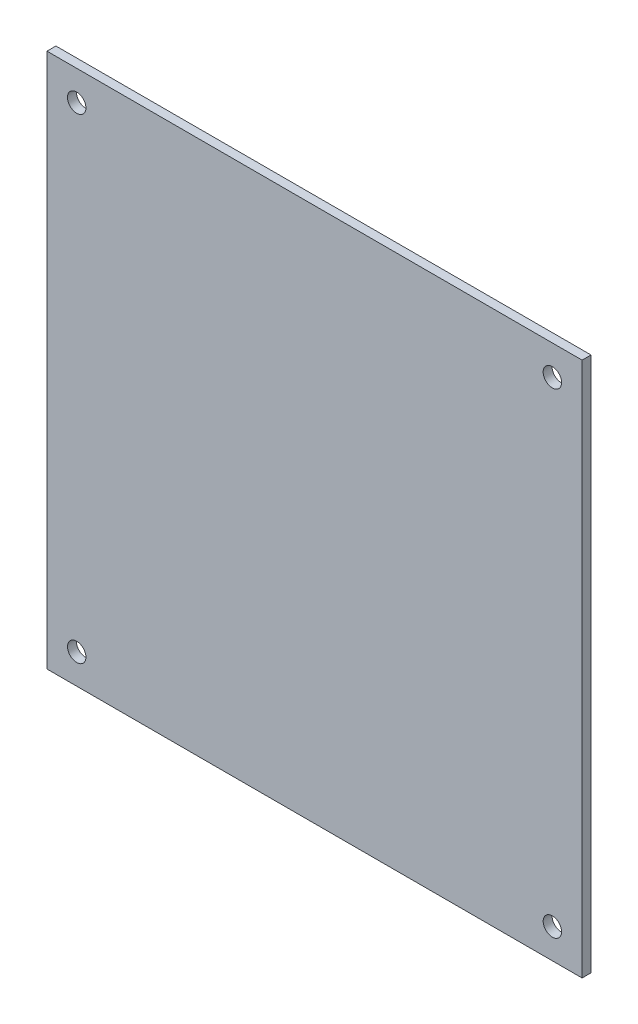
ISO-10303-21;
HEADER;
FILE_DESCRIPTION(('STEP AP214'),'2;1');
FILE_NAME('part.step','',(''),(''),'','','');
FILE_SCHEMA(('AUTOMOTIVE_DESIGN { 1 0 10303 214 1 1 1 1 }'));
ENDSEC;
DATA;
#1=APPLICATION_CONTEXT('core data for automotive mechanical design processes');
#2=APPLICATION_PROTOCOL_DEFINITION('international standard','automotive_design',2000,#1);
#3=PRODUCT_CONTEXT('',#1,'mechanical');
#4=PRODUCT('Part','Part','',(#3));
#5=PRODUCT_RELATED_PRODUCT_CATEGORY('part','',(#4));
#6=PRODUCT_DEFINITION_FORMATION('','',#4);
#7=PRODUCT_DEFINITION_CONTEXT('part definition',#1,'design');
#8=PRODUCT_DEFINITION('design','',#6,#7);
#9=PRODUCT_DEFINITION_SHAPE('','',#8);
#10=(LENGTH_UNIT() NAMED_UNIT(*) SI_UNIT(.MILLI.,.METRE.));
#11=(NAMED_UNIT(*) PLANE_ANGLE_UNIT() SI_UNIT($,.RADIAN.));
#12=(NAMED_UNIT(*) SI_UNIT($,.STERADIAN.) SOLID_ANGLE_UNIT());
#13=UNCERTAINTY_MEASURE_WITH_UNIT(LENGTH_MEASURE(1.E-05),#10,'distance_accuracy_value','');
#14=(GEOMETRIC_REPRESENTATION_CONTEXT(3) GLOBAL_UNCERTAINTY_ASSIGNED_CONTEXT((#13)) GLOBAL_UNIT_ASSIGNED_CONTEXT((#10,
#11,#12)) REPRESENTATION_CONTEXT('',''));
#15=CARTESIAN_POINT('',(0.,0.,0.));
#16=DIRECTION('',(0.,0.,1.));
#17=DIRECTION('',(1.,0.,0.));
#18=AXIS2_PLACEMENT_3D('',#15,#16,#17);
#19=CARTESIAN_POINT('',(-45.,-45.,1.5));
#20=DIRECTION('',(1.,0.,0.));
#21=DIRECTION('',(0.,0.,-1.));
#22=AXIS2_PLACEMENT_3D('',#19,#20,#21);
#23=PLANE('',#22);
#24=DIRECTION('',(0.,-1.,0.));
#25=VECTOR('',#24,1.);
#26=CARTESIAN_POINT('',(-45.,-45.,0.));
#27=LINE('',#26,#25);
#28=CARTESIAN_POINT('',(-45.,45.,0.));
#29=VERTEX_POINT('',#28);
#30=CARTESIAN_POINT('',(-45.,-45.,0.));
#31=VERTEX_POINT('',#30);
#32=EDGE_CURVE('E98',#29,#31,#27,.T.);
#33=ORIENTED_EDGE('',*,*,#32,.T.);
#34=DIRECTION('',(0.,0.,-1.));
#35=VECTOR('',#34,1.);
#36=CARTESIAN_POINT('',(-45.,-45.,1.5));
#37=LINE('',#36,#35);
#38=CARTESIAN_POINT('',(-45.,-45.,1.5));
#39=VERTEX_POINT('',#38);
#40=EDGE_CURVE('E11',#39,#31,#37,.T.);
#41=ORIENTED_EDGE('',*,*,#40,.F.);
#42=DIRECTION('',(0.,-1.,0.));
#43=VECTOR('',#42,1.);
#44=CARTESIAN_POINT('',(-45.,-45.,1.5));
#45=LINE('',#44,#43);
#46=CARTESIAN_POINT('',(-45.,45.,1.5));
#47=VERTEX_POINT('',#46);
#48=EDGE_CURVE('E86',#47,#39,#45,.T.);
#49=ORIENTED_EDGE('',*,*,#48,.F.);
#50=DIRECTION('',(0.,0.,-1.));
#51=VECTOR('',#50,1.);
#52=CARTESIAN_POINT('',(-45.,45.,1.5));
#53=LINE('',#52,#51);
#54=EDGE_CURVE('E94',#47,#29,#53,.T.);
#55=ORIENTED_EDGE('',*,*,#54,.T.);
#56=EDGE_LOOP('',(#33,#41,#49,#55));
#57=FACE_BOUND('',#56,.T.);
#58=ADVANCED_FACE('F35',(#57),#23,.F.);
#59=CARTESIAN_POINT('',(45.,-45.,1.5));
#60=DIRECTION('',(0.,1.,0.));
#61=DIRECTION('',(-1.,0.,0.));
#62=AXIS2_PLACEMENT_3D('',#59,#60,#61);
#63=PLANE('',#62);
#64=DIRECTION('',(1.,0.,0.));
#65=VECTOR('',#64,1.);
#66=CARTESIAN_POINT('',(45.,-45.,0.));
#67=LINE('',#66,#65);
#68=CARTESIAN_POINT('',(45.,-45.,0.));
#69=VERTEX_POINT('',#68);
#70=EDGE_CURVE('E90',#31,#69,#67,.T.);
#71=ORIENTED_EDGE('',*,*,#70,.T.);
#72=DIRECTION('',(0.,0.,-1.));
#73=VECTOR('',#72,1.);
#74=CARTESIAN_POINT('',(45.,-45.,1.5));
#75=LINE('',#74,#73);
#76=CARTESIAN_POINT('',(45.,-45.,1.5));
#77=VERTEX_POINT('',#76);
#78=EDGE_CURVE('E43',#77,#69,#75,.T.);
#79=ORIENTED_EDGE('',*,*,#78,.F.);
#80=DIRECTION('',(1.,0.,0.));
#81=VECTOR('',#80,1.);
#82=CARTESIAN_POINT('',(45.,-45.,1.5));
#83=LINE('',#82,#81);
#84=EDGE_CURVE('E81',#39,#77,#83,.T.);
#85=ORIENTED_EDGE('',*,*,#84,.F.);
#86=ORIENTED_EDGE('',*,*,#40,.T.);
#87=EDGE_LOOP('',(#71,#79,#85,#86));
#88=FACE_BOUND('',#87,.T.);
#89=ADVANCED_FACE('F89',(#88),#63,.F.);
#90=CARTESIAN_POINT('',(45.,-45.,1.5));
#91=DIRECTION('',(-1.,0.,0.));
#92=DIRECTION('',(0.,0.,1.));
#93=AXIS2_PLACEMENT_3D('',#90,#91,#92);
#94=PLANE('',#93);
#95=DIRECTION('',(0.,1.,0.));
#96=VECTOR('',#95,1.);
#97=CARTESIAN_POINT('',(45.,-45.,0.));
#98=LINE('',#97,#96);
#99=CARTESIAN_POINT('',(45.,45.,0.));
#100=VERTEX_POINT('',#99);
#101=EDGE_CURVE('E68',#69,#100,#98,.T.);
#102=ORIENTED_EDGE('',*,*,#101,.T.);
#103=DIRECTION('',(0.,0.,-1.));
#104=VECTOR('',#103,1.);
#105=CARTESIAN_POINT('',(45.,45.,1.5));
#106=LINE('',#105,#104);
#107=CARTESIAN_POINT('',(45.,45.,1.5));
#108=VERTEX_POINT('',#107);
#109=EDGE_CURVE('E91',#108,#100,#106,.T.);
#110=ORIENTED_EDGE('',*,*,#109,.F.);
#111=DIRECTION('',(0.,1.,0.));
#112=VECTOR('',#111,1.);
#113=CARTESIAN_POINT('',(45.,-45.,1.5));
#114=LINE('',#113,#112);
#115=EDGE_CURVE('E84',#77,#108,#114,.T.);
#116=ORIENTED_EDGE('',*,*,#115,.F.);
#117=ORIENTED_EDGE('',*,*,#78,.T.);
#118=EDGE_LOOP('',(#102,#110,#116,#117));
#119=FACE_BOUND('',#118,.T.);
#120=ADVANCED_FACE('F92',(#119),#94,.F.);
#121=CARTESIAN_POINT('',(45.,45.,1.5));
#122=DIRECTION('',(0.,-1.,0.));
#123=DIRECTION('',(1.,0.,0.));
#124=AXIS2_PLACEMENT_3D('',#121,#122,#123);
#125=PLANE('',#124);
#126=DIRECTION('',(-1.,0.,0.));
#127=VECTOR('',#126,1.);
#128=CARTESIAN_POINT('',(45.,45.,0.));
#129=LINE('',#128,#127);
#130=EDGE_CURVE('E74',#100,#29,#129,.T.);
#131=ORIENTED_EDGE('',*,*,#130,.T.);
#132=ORIENTED_EDGE('',*,*,#54,.F.);
#133=DIRECTION('',(-1.,0.,0.));
#134=VECTOR('',#133,1.);
#135=CARTESIAN_POINT('',(45.,45.,1.5));
#136=LINE('',#135,#134);
#137=EDGE_CURVE('E51',#108,#47,#136,.T.);
#138=ORIENTED_EDGE('',*,*,#137,.F.);
#139=ORIENTED_EDGE('',*,*,#109,.T.);
#140=EDGE_LOOP('',(#131,#132,#138,#139));
#141=FACE_BOUND('',#140,.T.);
#142=ADVANCED_FACE('F106',(#141),#125,.F.);
#143=CARTESIAN_POINT('',(0.,0.,1.5));
#144=DIRECTION('',(0.,0.,1.));
#145=DIRECTION('',(1.,0.,0.));
#146=AXIS2_PLACEMENT_3D('',#143,#144,#145);
#147=PLANE('',#146);
#148=CARTESIAN_POINT('',(-40.,40.,1.5));
#149=DIRECTION('',(0.,0.,1.));
#150=DIRECTION('',(1.,0.,0.));
#151=AXIS2_PLACEMENT_3D('',#148,#149,#150);
#152=CIRCLE('',#151,1.54999999999999);
#153=CARTESIAN_POINT('',(-38.45,40.,1.5));
#154=VERTEX_POINT('',#153);
#155=EDGE_CURVE('E132',#154,#154,#152,.T.);
#156=ORIENTED_EDGE('',*,*,#155,.F.);
#157=EDGE_LOOP('',(#156));
#158=FACE_BOUND('',#157,.T.);
#159=CARTESIAN_POINT('',(40.,40.,1.5));
#160=DIRECTION('',(0.,0.,1.));
#161=DIRECTION('',(1.,0.,0.));
#162=AXIS2_PLACEMENT_3D('',#159,#160,#161);
#163=CIRCLE('',#162,1.54999999999999);
#164=CARTESIAN_POINT('',(41.55,40.,1.5));
#165=VERTEX_POINT('',#164);
#166=EDGE_CURVE('E126',#165,#165,#163,.T.);
#167=ORIENTED_EDGE('',*,*,#166,.F.);
#168=EDGE_LOOP('',(#167));
#169=FACE_BOUND('',#168,.T.);
#170=CARTESIAN_POINT('',(40.,-40.,1.5));
#171=DIRECTION('',(0.,0.,1.));
#172=DIRECTION('',(1.,0.,0.));
#173=AXIS2_PLACEMENT_3D('',#170,#171,#172);
#174=CIRCLE('',#173,1.54999999999999);
#175=CARTESIAN_POINT('',(41.55,-40.,1.5));
#176=VERTEX_POINT('',#175);
#177=EDGE_CURVE('E120',#176,#176,#174,.T.);
#178=ORIENTED_EDGE('',*,*,#177,.F.);
#179=EDGE_LOOP('',(#178));
#180=FACE_BOUND('',#179,.T.);
#181=CARTESIAN_POINT('',(-40.,-40.,1.5));
#182=DIRECTION('',(0.,0.,1.));
#183=DIRECTION('',(1.,0.,0.));
#184=AXIS2_PLACEMENT_3D('',#181,#182,#183);
#185=CIRCLE('',#184,1.54999999999999);
#186=CARTESIAN_POINT('',(-38.45,-40.,1.5));
#187=VERTEX_POINT('',#186);
#188=EDGE_CURVE('E114',#187,#187,#185,.T.);
#189=ORIENTED_EDGE('',*,*,#188,.F.);
#190=EDGE_LOOP('',(#189));
#191=FACE_BOUND('',#190,.T.);
#192=ORIENTED_EDGE('',*,*,#48,.T.);
#193=ORIENTED_EDGE('',*,*,#84,.T.);
#194=ORIENTED_EDGE('',*,*,#115,.T.);
#195=ORIENTED_EDGE('',*,*,#137,.T.);
#196=EDGE_LOOP('',(#192,#193,#194,#195));
#197=FACE_BOUND('',#196,.T.);
#198=ADVANCED_FACE('F82',(#158,#169,#180,#191,#197),#147,.T.);
#199=CARTESIAN_POINT('',(0.,0.,0.));
#200=DIRECTION('',(0.,0.,1.));
#201=DIRECTION('',(1.,0.,0.));
#202=AXIS2_PLACEMENT_3D('',#199,#200,#201);
#203=PLANE('',#202);
#204=CARTESIAN_POINT('',(-40.,40.,0.));
#205=DIRECTION('',(0.,0.,1.));
#206=DIRECTION('',(1.,0.,0.));
#207=AXIS2_PLACEMENT_3D('',#204,#205,#206);
#208=CIRCLE('',#207,1.55);
#209=CARTESIAN_POINT('',(-38.45,40.,0.));
#210=VERTEX_POINT('',#209);
#211=EDGE_CURVE('E129',#210,#210,#208,.T.);
#212=ORIENTED_EDGE('',*,*,#211,.T.);
#213=EDGE_LOOP('',(#212));
#214=FACE_BOUND('',#213,.T.);
#215=CARTESIAN_POINT('',(40.,40.,0.));
#216=DIRECTION('',(0.,0.,1.));
#217=DIRECTION('',(1.,0.,0.));
#218=AXIS2_PLACEMENT_3D('',#215,#216,#217);
#219=CIRCLE('',#218,1.55);
#220=CARTESIAN_POINT('',(41.55,40.,0.));
#221=VERTEX_POINT('',#220);
#222=EDGE_CURVE('E123',#221,#221,#219,.T.);
#223=ORIENTED_EDGE('',*,*,#222,.T.);
#224=EDGE_LOOP('',(#223));
#225=FACE_BOUND('',#224,.T.);
#226=CARTESIAN_POINT('',(40.,-40.,0.));
#227=DIRECTION('',(0.,0.,1.));
#228=DIRECTION('',(1.,0.,0.));
#229=AXIS2_PLACEMENT_3D('',#226,#227,#228);
#230=CIRCLE('',#229,1.55);
#231=CARTESIAN_POINT('',(41.55,-40.,0.));
#232=VERTEX_POINT('',#231);
#233=EDGE_CURVE('E117',#232,#232,#230,.T.);
#234=ORIENTED_EDGE('',*,*,#233,.T.);
#235=EDGE_LOOP('',(#234));
#236=FACE_BOUND('',#235,.T.);
#237=CARTESIAN_POINT('',(-40.,-40.,0.));
#238=DIRECTION('',(0.,0.,1.));
#239=DIRECTION('',(1.,0.,0.));
#240=AXIS2_PLACEMENT_3D('',#237,#238,#239);
#241=CIRCLE('',#240,1.55);
#242=CARTESIAN_POINT('',(-38.45,-40.,0.));
#243=VERTEX_POINT('',#242);
#244=EDGE_CURVE('E101',#243,#243,#241,.T.);
#245=ORIENTED_EDGE('',*,*,#244,.T.);
#246=EDGE_LOOP('',(#245));
#247=FACE_BOUND('',#246,.T.);
#248=ORIENTED_EDGE('',*,*,#32,.F.);
#249=ORIENTED_EDGE('',*,*,#130,.F.);
#250=ORIENTED_EDGE('',*,*,#101,.F.);
#251=ORIENTED_EDGE('',*,*,#70,.F.);
#252=EDGE_LOOP('',(#248,#249,#250,#251));
#253=FACE_BOUND('',#252,.T.);
#254=ADVANCED_FACE('F109',(#214,#225,#236,#247,#253),#203,.F.);
#255=CARTESIAN_POINT('',(-40.,-40.,1.5));
#256=DIRECTION('',(0.,0.,1.));
#257=DIRECTION('',(1.,0.,0.));
#258=AXIS2_PLACEMENT_3D('',#255,#256,#257);
#259=CYLINDRICAL_SURFACE('',#258,1.55);
#260=ORIENTED_EDGE('',*,*,#244,.F.);
#261=EDGE_LOOP('',(#260));
#262=FACE_BOUND('',#261,.T.);
#263=ORIENTED_EDGE('',*,*,#188,.T.);
#264=EDGE_LOOP('',(#263));
#265=FACE_BOUND('',#264,.T.);
#266=ADVANCED_FACE('F147',(#262,#265),#259,.F.);
#267=CARTESIAN_POINT('',(40.,-40.,1.5));
#268=DIRECTION('',(0.,0.,1.));
#269=DIRECTION('',(1.,0.,0.));
#270=AXIS2_PLACEMENT_3D('',#267,#268,#269);
#271=CYLINDRICAL_SURFACE('',#270,1.55);
#272=ORIENTED_EDGE('',*,*,#233,.F.);
#273=EDGE_LOOP('',(#272));
#274=FACE_BOUND('',#273,.T.);
#275=ORIENTED_EDGE('',*,*,#177,.T.);
#276=EDGE_LOOP('',(#275));
#277=FACE_BOUND('',#276,.T.);
#278=ADVANCED_FACE('F149',(#274,#277),#271,.F.);
#279=CARTESIAN_POINT('',(40.,40.,1.5));
#280=DIRECTION('',(0.,0.,1.));
#281=DIRECTION('',(1.,0.,0.));
#282=AXIS2_PLACEMENT_3D('',#279,#280,#281);
#283=CYLINDRICAL_SURFACE('',#282,1.55);
#284=ORIENTED_EDGE('',*,*,#222,.F.);
#285=EDGE_LOOP('',(#284));
#286=FACE_BOUND('',#285,.T.);
#287=ORIENTED_EDGE('',*,*,#166,.T.);
#288=EDGE_LOOP('',(#287));
#289=FACE_BOUND('',#288,.T.);
#290=ADVANCED_FACE('F156',(#286,#289),#283,.F.);
#291=CARTESIAN_POINT('',(-40.,40.,1.5));
#292=DIRECTION('',(0.,0.,1.));
#293=DIRECTION('',(1.,0.,0.));
#294=AXIS2_PLACEMENT_3D('',#291,#292,#293);
#295=CYLINDRICAL_SURFACE('',#294,1.55);
#296=ORIENTED_EDGE('',*,*,#211,.F.);
#297=EDGE_LOOP('',(#296));
#298=FACE_BOUND('',#297,.T.);
#299=ORIENTED_EDGE('',*,*,#155,.T.);
#300=EDGE_LOOP('',(#299));
#301=FACE_BOUND('',#300,.T.);
#302=ADVANCED_FACE('F136',(#298,#301),#295,.F.);
#303=CLOSED_SHELL('',(#58,#89,#120,#142,#198,#254,#266,#278,#290,#302));
#304=MANIFOLD_SOLID_BREP('B2',#303);
#305=ADVANCED_BREP_SHAPE_REPRESENTATION('',(#18,#304),#14);
#306=SHAPE_DEFINITION_REPRESENTATION(#9,#305);
ENDSEC;
END-ISO-10303-21;
